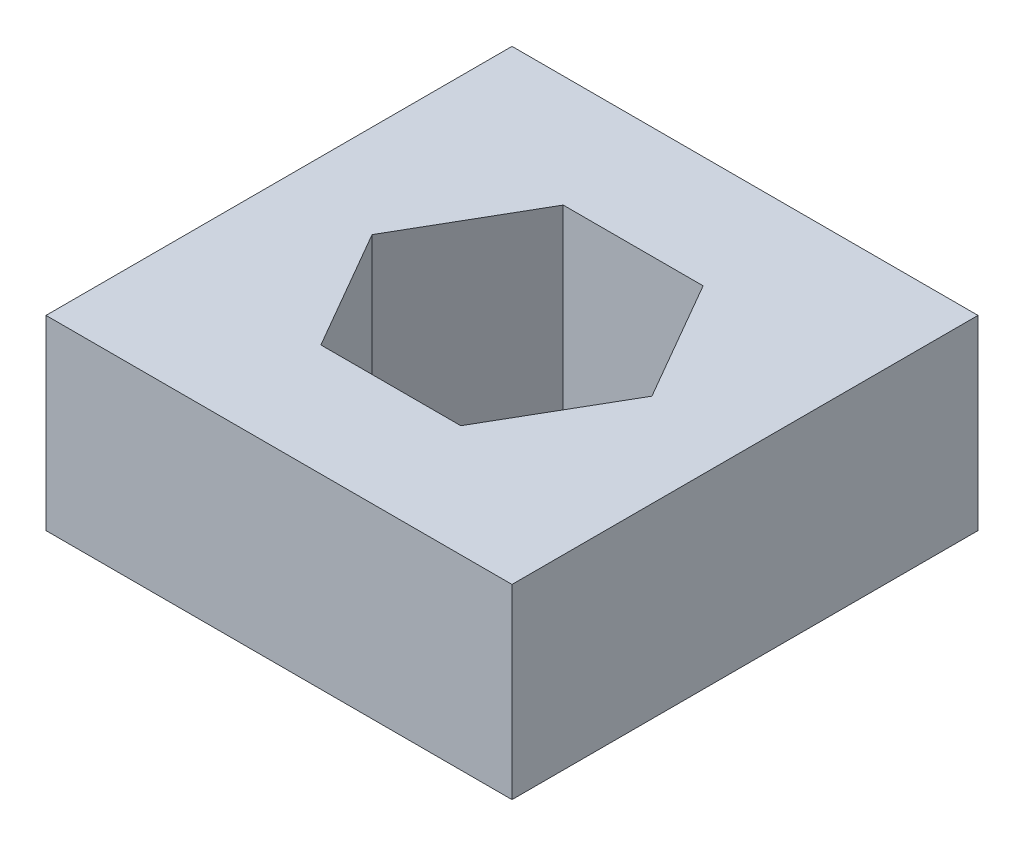
ISO-10303-21;
HEADER;
FILE_DESCRIPTION(('STEP AP214'),'2;1');
FILE_NAME('part.step','',(''),(''),'','','');
FILE_SCHEMA(('AUTOMOTIVE_DESIGN { 1 0 10303 214 1 1 1 1 }'));
ENDSEC;
DATA;
#1=APPLICATION_CONTEXT('core data for automotive mechanical design processes');
#2=APPLICATION_PROTOCOL_DEFINITION('international standard','automotive_design',2000,#1);
#3=PRODUCT_CONTEXT('',#1,'mechanical');
#4=PRODUCT('Part','Part','',(#3));
#5=PRODUCT_RELATED_PRODUCT_CATEGORY('part','',(#4));
#6=PRODUCT_DEFINITION_FORMATION('','',#4);
#7=PRODUCT_DEFINITION_CONTEXT('part definition',#1,'design');
#8=PRODUCT_DEFINITION('design','',#6,#7);
#9=PRODUCT_DEFINITION_SHAPE('','',#8);
#10=(LENGTH_UNIT() NAMED_UNIT(*) SI_UNIT(.MILLI.,.METRE.));
#11=(NAMED_UNIT(*) PLANE_ANGLE_UNIT() SI_UNIT($,.RADIAN.));
#12=(NAMED_UNIT(*) SI_UNIT($,.STERADIAN.) SOLID_ANGLE_UNIT());
#13=UNCERTAINTY_MEASURE_WITH_UNIT(LENGTH_MEASURE(1.E-05),#10,'distance_accuracy_value','');
#14=(GEOMETRIC_REPRESENTATION_CONTEXT(3) GLOBAL_UNCERTAINTY_ASSIGNED_CONTEXT((#13)) GLOBAL_UNIT_ASSIGNED_CONTEXT((#10,
#11,#12)) REPRESENTATION_CONTEXT('',''));
#15=CARTESIAN_POINT('',(0.,0.,0.));
#16=DIRECTION('',(0.,0.,1.));
#17=DIRECTION('',(1.,0.,0.));
#18=AXIS2_PLACEMENT_3D('',#15,#16,#17);
#19=CARTESIAN_POINT('',(0.,2.,0.));
#20=DIRECTION('',(0.,1.,0.));
#21=DIRECTION('',(0.,0.,1.));
#22=AXIS2_PLACEMENT_3D('',#19,#20,#21);
#23=PLANE('',#22);
#24=DIRECTION('',(0.,0.,1.));
#25=VECTOR('',#24,1.);
#26=CARTESIAN_POINT('',(-2.19330855018587,2.,-1.75650557620818));
#27=LINE('',#26,#25);
#28=CARTESIAN_POINT('',(-2.19330855018587,2.,-1.75650557620818));
#29=VERTEX_POINT('',#28);
#30=CARTESIAN_POINT('',(-2.19330855018587,2.,3.24349442379182));
#31=VERTEX_POINT('',#30);
#32=EDGE_CURVE('E165',#29,#31,#27,.T.);
#33=ORIENTED_EDGE('',*,*,#32,.T.);
#34=DIRECTION('',(1.,0.,0.));
#35=VECTOR('',#34,1.);
#36=CARTESIAN_POINT('',(-2.19330855018587,2.,3.24349442379182));
#37=LINE('',#36,#35);
#38=CARTESIAN_POINT('',(2.80669144981413,2.,3.24349442379182));
#39=VERTEX_POINT('',#38);
#40=EDGE_CURVE('E168',#31,#39,#37,.T.);
#41=ORIENTED_EDGE('',*,*,#40,.T.);
#42=DIRECTION('',(0.,0.,-1.));
#43=VECTOR('',#42,1.);
#44=CARTESIAN_POINT('',(2.80669144981413,2.,-1.75650557620818));
#45=LINE('',#44,#43);
#46=CARTESIAN_POINT('',(2.80669144981413,2.,-1.75650557620818));
#47=VERTEX_POINT('',#46);
#48=EDGE_CURVE('E171',#39,#47,#45,.T.);
#49=ORIENTED_EDGE('',*,*,#48,.T.);
#50=DIRECTION('',(-1.,0.,0.));
#51=VECTOR('',#50,1.);
#52=CARTESIAN_POINT('',(-2.19330855018587,2.,-1.75650557620818));
#53=LINE('',#52,#51);
#54=EDGE_CURVE('E173',#47,#29,#53,.T.);
#55=ORIENTED_EDGE('',*,*,#54,.T.);
#56=EDGE_LOOP('',(#33,#41,#49,#55));
#57=FACE_BOUND('',#56,.T.);
#58=DIRECTION('',(-0.5,0.,-0.866025403784438));
#59=VECTOR('',#58,1.);
#60=CARTESIAN_POINT('',(1.80780214970715,2.,0.743494423791823));
#61=LINE('',#60,#59);
#62=CARTESIAN_POINT('',(1.80780214970715,2.,0.743494423791823));
#63=VERTEX_POINT('',#62);
#64=CARTESIAN_POINT('',(1.05724679976064,2.,-0.556505576208176));
#65=VERTEX_POINT('',#64);
#66=EDGE_CURVE('E122',#63,#65,#61,.T.);
#67=ORIENTED_EDGE('',*,*,#66,.F.);
#68=DIRECTION('',(0.5,0.,-0.866025403784439));
#69=VECTOR('',#68,1.);
#70=CARTESIAN_POINT('',(1.05724679976064,2.,2.04349442379182));
#71=LINE('',#70,#69);
#72=CARTESIAN_POINT('',(1.05724679976064,2.,2.04349442379182));
#73=VERTEX_POINT('',#72);
#74=EDGE_CURVE('E114',#73,#63,#71,.T.);
#75=ORIENTED_EDGE('',*,*,#74,.F.);
#76=DIRECTION('',(1.,0.,0.));
#77=VECTOR('',#76,1.);
#78=CARTESIAN_POINT('',(-0.443863900132386,2.,2.04349442379182));
#79=LINE('',#78,#77);
#80=CARTESIAN_POINT('',(-0.443863900132386,2.,2.04349442379182));
#81=VERTEX_POINT('',#80);
#82=EDGE_CURVE('E143',#81,#73,#79,.T.);
#83=ORIENTED_EDGE('',*,*,#82,.F.);
#84=DIRECTION('',(0.5,0.,0.866025403784439));
#85=VECTOR('',#84,1.);
#86=CARTESIAN_POINT('',(-1.1944192500789,2.,0.743494423791824));
#87=LINE('',#86,#85);
#88=CARTESIAN_POINT('',(-1.1944192500789,2.,0.743494423791824));
#89=VERTEX_POINT('',#88);
#90=EDGE_CURVE('E141',#89,#81,#87,.T.);
#91=ORIENTED_EDGE('',*,*,#90,.F.);
#92=DIRECTION('',(-0.5,0.,0.866025403784439));
#93=VECTOR('',#92,1.);
#94=CARTESIAN_POINT('',(-0.443863900132386,2.,-0.556505576208177));
#95=LINE('',#94,#93);
#96=CARTESIAN_POINT('',(-0.443863900132386,2.,-0.556505576208177));
#97=VERTEX_POINT('',#96);
#98=EDGE_CURVE('E137',#97,#89,#95,.T.);
#99=ORIENTED_EDGE('',*,*,#98,.F.);
#100=DIRECTION('',(-1.,0.,0.));
#101=VECTOR('',#100,1.);
#102=CARTESIAN_POINT('',(1.05724679976064,2.,-0.556505576208176));
#103=LINE('',#102,#101);
#104=EDGE_CURVE('E135',#65,#97,#103,.T.);
#105=ORIENTED_EDGE('',*,*,#104,.F.);
#106=EDGE_LOOP('',(#67,#75,#83,#91,#99,#105));
#107=FACE_BOUND('',#106,.T.);
#108=ADVANCED_FACE('F37',(#57,#107),#23,.T.);
#109=CARTESIAN_POINT('',(0.,0.,0.));
#110=DIRECTION('',(0.,1.,0.));
#111=DIRECTION('',(0.,0.,1.));
#112=AXIS2_PLACEMENT_3D('',#109,#110,#111);
#113=PLANE('',#112);
#114=DIRECTION('',(0.,0.,1.));
#115=VECTOR('',#114,1.);
#116=CARTESIAN_POINT('',(-2.19330855018587,0.,-1.75650557620818));
#117=LINE('',#116,#115);
#118=CARTESIAN_POINT('',(-2.19330855018587,0.,-1.75650557620818));
#119=VERTEX_POINT('',#118);
#120=CARTESIAN_POINT('',(-2.19330855018587,0.,3.24349442379182));
#121=VERTEX_POINT('',#120);
#122=EDGE_CURVE('E130',#119,#121,#117,.T.);
#123=ORIENTED_EDGE('',*,*,#122,.F.);
#124=DIRECTION('',(-1.,0.,0.));
#125=VECTOR('',#124,1.);
#126=CARTESIAN_POINT('',(-2.19330855018587,0.,-1.75650557620818));
#127=LINE('',#126,#125);
#128=CARTESIAN_POINT('',(2.80669144981413,0.,-1.75650557620818));
#129=VERTEX_POINT('',#128);
#130=EDGE_CURVE('E169',#129,#119,#127,.T.);
#131=ORIENTED_EDGE('',*,*,#130,.F.);
#132=DIRECTION('',(0.,0.,-1.));
#133=VECTOR('',#132,1.);
#134=CARTESIAN_POINT('',(2.80669144981413,0.,-1.75650557620818));
#135=LINE('',#134,#133);
#136=CARTESIAN_POINT('',(2.80669144981413,0.,3.24349442379182));
#137=VERTEX_POINT('',#136);
#138=EDGE_CURVE('E180',#137,#129,#135,.T.);
#139=ORIENTED_EDGE('',*,*,#138,.F.);
#140=DIRECTION('',(1.,0.,0.));
#141=VECTOR('',#140,1.);
#142=CARTESIAN_POINT('',(-2.19330855018587,0.,3.24349442379182));
#143=LINE('',#142,#141);
#144=EDGE_CURVE('E178',#121,#137,#143,.T.);
#145=ORIENTED_EDGE('',*,*,#144,.F.);
#146=EDGE_LOOP('',(#123,#131,#139,#145));
#147=FACE_BOUND('',#146,.T.);
#148=DIRECTION('',(0.5,0.,-0.866025403784439));
#149=VECTOR('',#148,1.);
#150=CARTESIAN_POINT('',(1.05724679976064,0.,2.04349442379182));
#151=LINE('',#150,#149);
#152=CARTESIAN_POINT('',(1.05724679976064,0.,2.04349442379182));
#153=VERTEX_POINT('',#152);
#154=CARTESIAN_POINT('',(1.80780214970715,0.,0.743494423791823));
#155=VERTEX_POINT('',#154);
#156=EDGE_CURVE('E60',#153,#155,#151,.T.);
#157=ORIENTED_EDGE('',*,*,#156,.T.);
#158=DIRECTION('',(-0.5,0.,-0.866025403784438));
#159=VECTOR('',#158,1.);
#160=CARTESIAN_POINT('',(1.80780214970715,0.,0.743494423791823));
#161=LINE('',#160,#159);
#162=CARTESIAN_POINT('',(1.05724679976064,0.,-0.556505576208176));
#163=VERTEX_POINT('',#162);
#164=EDGE_CURVE('E129',#155,#163,#161,.T.);
#165=ORIENTED_EDGE('',*,*,#164,.T.);
#166=DIRECTION('',(-1.,0.,0.));
#167=VECTOR('',#166,1.);
#168=CARTESIAN_POINT('',(1.05724679976064,0.,-0.556505576208176));
#169=LINE('',#168,#167);
#170=CARTESIAN_POINT('',(-0.443863900132386,0.,-0.556505576208177));
#171=VERTEX_POINT('',#170);
#172=EDGE_CURVE('E147',#163,#171,#169,.T.);
#173=ORIENTED_EDGE('',*,*,#172,.T.);
#174=DIRECTION('',(-0.5,0.,0.866025403784439));
#175=VECTOR('',#174,1.);
#176=CARTESIAN_POINT('',(-0.443863900132386,0.,-0.556505576208177));
#177=LINE('',#176,#175);
#178=CARTESIAN_POINT('',(-1.1944192500789,0.,0.743494423791824));
#179=VERTEX_POINT('',#178);
#180=EDGE_CURVE('E150',#171,#179,#177,.T.);
#181=ORIENTED_EDGE('',*,*,#180,.T.);
#182=DIRECTION('',(0.5,0.,0.866025403784439));
#183=VECTOR('',#182,1.);
#184=CARTESIAN_POINT('',(-1.1944192500789,0.,0.743494423791824));
#185=LINE('',#184,#183);
#186=CARTESIAN_POINT('',(-0.443863900132386,0.,2.04349442379182));
#187=VERTEX_POINT('',#186);
#188=EDGE_CURVE('E153',#179,#187,#185,.T.);
#189=ORIENTED_EDGE('',*,*,#188,.T.);
#190=DIRECTION('',(1.,0.,0.));
#191=VECTOR('',#190,1.);
#192=CARTESIAN_POINT('',(-0.443863900132386,0.,2.04349442379182));
#193=LINE('',#192,#191);
#194=EDGE_CURVE('E123',#187,#153,#193,.T.);
#195=ORIENTED_EDGE('',*,*,#194,.T.);
#196=EDGE_LOOP('',(#157,#165,#173,#181,#189,#195));
#197=FACE_BOUND('',#196,.T.);
#198=ADVANCED_FACE('F198',(#147,#197),#113,.F.);
#199=CARTESIAN_POINT('',(-2.19330855018587,2.,-1.75650557620818));
#200=DIRECTION('',(1.,0.,0.));
#201=DIRECTION('',(0.,0.,-1.));
#202=AXIS2_PLACEMENT_3D('',#199,#200,#201);
#203=PLANE('',#202);
#204=ORIENTED_EDGE('',*,*,#122,.T.);
#205=DIRECTION('',(0.,-1.,0.));
#206=VECTOR('',#205,1.);
#207=CARTESIAN_POINT('',(-2.19330855018587,2.,3.24349442379182));
#208=LINE('',#207,#206);
#209=EDGE_CURVE('E11',#31,#121,#208,.T.);
#210=ORIENTED_EDGE('',*,*,#209,.F.);
#211=ORIENTED_EDGE('',*,*,#32,.F.);
#212=DIRECTION('',(0.,-1.,0.));
#213=VECTOR('',#212,1.);
#214=CARTESIAN_POINT('',(-2.19330855018587,2.,-1.75650557620818));
#215=LINE('',#214,#213);
#216=EDGE_CURVE('E175',#29,#119,#215,.T.);
#217=ORIENTED_EDGE('',*,*,#216,.T.);
#218=EDGE_LOOP('',(#204,#210,#211,#217));
#219=FACE_BOUND('',#218,.T.);
#220=ADVANCED_FACE('F39',(#219),#203,.F.);
#221=CARTESIAN_POINT('',(-2.19330855018587,2.,3.24349442379182));
#222=DIRECTION('',(0.,0.,-1.));
#223=DIRECTION('',(-1.,0.,0.));
#224=AXIS2_PLACEMENT_3D('',#221,#222,#223);
#225=PLANE('',#224);
#226=ORIENTED_EDGE('',*,*,#144,.T.);
#227=DIRECTION('',(0.,-1.,0.));
#228=VECTOR('',#227,1.);
#229=CARTESIAN_POINT('',(2.80669144981413,2.,3.24349442379182));
#230=LINE('',#229,#228);
#231=EDGE_CURVE('E45',#39,#137,#230,.T.);
#232=ORIENTED_EDGE('',*,*,#231,.F.);
#233=ORIENTED_EDGE('',*,*,#40,.F.);
#234=ORIENTED_EDGE('',*,*,#209,.T.);
#235=EDGE_LOOP('',(#226,#232,#233,#234));
#236=FACE_BOUND('',#235,.T.);
#237=ADVANCED_FACE('F208',(#236),#225,.F.);
#238=CARTESIAN_POINT('',(2.80669144981413,2.,-1.75650557620818));
#239=DIRECTION('',(-1.,0.,0.));
#240=DIRECTION('',(0.,0.,1.));
#241=AXIS2_PLACEMENT_3D('',#238,#239,#240);
#242=PLANE('',#241);
#243=ORIENTED_EDGE('',*,*,#138,.T.);
#244=DIRECTION('',(0.,-1.,0.));
#245=VECTOR('',#244,1.);
#246=CARTESIAN_POINT('',(2.80669144981413,2.,-1.75650557620818));
#247=LINE('',#246,#245);
#248=EDGE_CURVE('E185',#47,#129,#247,.T.);
#249=ORIENTED_EDGE('',*,*,#248,.F.);
#250=ORIENTED_EDGE('',*,*,#48,.F.);
#251=ORIENTED_EDGE('',*,*,#231,.T.);
#252=EDGE_LOOP('',(#243,#249,#250,#251));
#253=FACE_BOUND('',#252,.T.);
#254=ADVANCED_FACE('F192',(#253),#242,.F.);
#255=CARTESIAN_POINT('',(-2.19330855018587,2.,-1.75650557620818));
#256=DIRECTION('',(0.,0.,1.));
#257=DIRECTION('',(1.,0.,0.));
#258=AXIS2_PLACEMENT_3D('',#255,#256,#257);
#259=PLANE('',#258);
#260=ORIENTED_EDGE('',*,*,#130,.T.);
#261=ORIENTED_EDGE('',*,*,#216,.F.);
#262=ORIENTED_EDGE('',*,*,#54,.F.);
#263=ORIENTED_EDGE('',*,*,#248,.T.);
#264=EDGE_LOOP('',(#260,#261,#262,#263));
#265=FACE_BOUND('',#264,.T.);
#266=ADVANCED_FACE('F202',(#265),#259,.F.);
#267=CARTESIAN_POINT('',(1.05724679976064,2.,2.04349442379182));
#268=DIRECTION('',(-0.866025403784439,0.,-0.5));
#269=DIRECTION('',(-0.5,0.,0.866025403784439));
#270=AXIS2_PLACEMENT_3D('',#267,#268,#269);
#271=PLANE('',#270);
#272=ORIENTED_EDGE('',*,*,#156,.F.);
#273=DIRECTION('',(0.,-1.,0.));
#274=VECTOR('',#273,1.);
#275=CARTESIAN_POINT('',(1.05724679976064,2.,2.04349442379182));
#276=LINE('',#275,#274);
#277=EDGE_CURVE('E118',#73,#153,#276,.T.);
#278=ORIENTED_EDGE('',*,*,#277,.F.);
#279=ORIENTED_EDGE('',*,*,#74,.T.);
#280=DIRECTION('',(0.,-1.,0.));
#281=VECTOR('',#280,1.);
#282=CARTESIAN_POINT('',(1.80780214970715,2.,0.743494423791823));
#283=LINE('',#282,#281);
#284=EDGE_CURVE('E117',#63,#155,#283,.T.);
#285=ORIENTED_EDGE('',*,*,#284,.T.);
#286=EDGE_LOOP('',(#272,#278,#279,#285));
#287=FACE_BOUND('',#286,.T.);
#288=ADVANCED_FACE('F116',(#287),#271,.T.);
#289=CARTESIAN_POINT('',(1.80780214970715,2.,0.743494423791823));
#290=DIRECTION('',(-0.866025403784439,0.,0.5));
#291=DIRECTION('',(0.5,0.,0.866025403784439));
#292=AXIS2_PLACEMENT_3D('',#289,#290,#291);
#293=PLANE('',#292);
#294=ORIENTED_EDGE('',*,*,#164,.F.);
#295=ORIENTED_EDGE('',*,*,#284,.F.);
#296=ORIENTED_EDGE('',*,*,#66,.T.);
#297=DIRECTION('',(0.,-1.,0.));
#298=VECTOR('',#297,1.);
#299=CARTESIAN_POINT('',(1.05724679976064,2.,-0.556505576208176));
#300=LINE('',#299,#298);
#301=EDGE_CURVE('E131',#65,#163,#300,.T.);
#302=ORIENTED_EDGE('',*,*,#301,.T.);
#303=EDGE_LOOP('',(#294,#295,#296,#302));
#304=FACE_BOUND('',#303,.T.);
#305=ADVANCED_FACE('F126',(#304),#293,.T.);
#306=CARTESIAN_POINT('',(1.05724679976064,2.,-0.556505576208176));
#307=DIRECTION('',(0.,0.,1.));
#308=DIRECTION('',(1.,0.,0.));
#309=AXIS2_PLACEMENT_3D('',#306,#307,#308);
#310=PLANE('',#309);
#311=ORIENTED_EDGE('',*,*,#172,.F.);
#312=ORIENTED_EDGE('',*,*,#301,.F.);
#313=ORIENTED_EDGE('',*,*,#104,.T.);
#314=DIRECTION('',(0.,-1.,0.));
#315=VECTOR('',#314,1.);
#316=CARTESIAN_POINT('',(-0.443863900132386,2.,-0.556505576208177));
#317=LINE('',#316,#315);
#318=EDGE_CURVE('E162',#97,#171,#317,.T.);
#319=ORIENTED_EDGE('',*,*,#318,.T.);
#320=EDGE_LOOP('',(#311,#312,#313,#319));
#321=FACE_BOUND('',#320,.T.);
#322=ADVANCED_FACE('F231',(#321),#310,.T.);
#323=CARTESIAN_POINT('',(-0.443863900132386,2.,-0.556505576208177));
#324=DIRECTION('',(0.866025403784439,0.,0.5));
#325=DIRECTION('',(0.5,0.,-0.866025403784439));
#326=AXIS2_PLACEMENT_3D('',#323,#324,#325);
#327=PLANE('',#326);
#328=ORIENTED_EDGE('',*,*,#180,.F.);
#329=ORIENTED_EDGE('',*,*,#318,.F.);
#330=ORIENTED_EDGE('',*,*,#98,.T.);
#331=DIRECTION('',(0.,-1.,0.));
#332=VECTOR('',#331,1.);
#333=CARTESIAN_POINT('',(-1.1944192500789,2.,0.743494423791824));
#334=LINE('',#333,#332);
#335=EDGE_CURVE('E160',#89,#179,#334,.T.);
#336=ORIENTED_EDGE('',*,*,#335,.T.);
#337=EDGE_LOOP('',(#328,#329,#330,#336));
#338=FACE_BOUND('',#337,.T.);
#339=ADVANCED_FACE('F235',(#338),#327,.T.);
#340=CARTESIAN_POINT('',(-1.1944192500789,2.,0.743494423791824));
#341=DIRECTION('',(0.866025403784439,0.,-0.5));
#342=DIRECTION('',(-0.5,0.,-0.866025403784439));
#343=AXIS2_PLACEMENT_3D('',#340,#341,#342);
#344=PLANE('',#343);
#345=ORIENTED_EDGE('',*,*,#188,.F.);
#346=ORIENTED_EDGE('',*,*,#335,.F.);
#347=ORIENTED_EDGE('',*,*,#90,.T.);
#348=DIRECTION('',(0.,-1.,0.));
#349=VECTOR('',#348,1.);
#350=CARTESIAN_POINT('',(-0.443863900132386,2.,2.04349442379182));
#351=LINE('',#350,#349);
#352=EDGE_CURVE('E52',#81,#187,#351,.T.);
#353=ORIENTED_EDGE('',*,*,#352,.T.);
#354=EDGE_LOOP('',(#345,#346,#347,#353));
#355=FACE_BOUND('',#354,.T.);
#356=ADVANCED_FACE('F241',(#355),#344,.T.);
#357=CARTESIAN_POINT('',(-0.443863900132386,2.,2.04349442379182));
#358=DIRECTION('',(0.,0.,-1.));
#359=DIRECTION('',(-1.,0.,0.));
#360=AXIS2_PLACEMENT_3D('',#357,#358,#359);
#361=PLANE('',#360);
#362=ORIENTED_EDGE('',*,*,#194,.F.);
#363=ORIENTED_EDGE('',*,*,#352,.F.);
#364=ORIENTED_EDGE('',*,*,#82,.T.);
#365=ORIENTED_EDGE('',*,*,#277,.T.);
#366=EDGE_LOOP('',(#362,#363,#364,#365));
#367=FACE_BOUND('',#366,.T.);
#368=ADVANCED_FACE('F245',(#367),#361,.T.);
#369=CLOSED_SHELL('',(#108,#198,#220,#237,#254,#266,#288,#305,#322,#339,#356,#368));
#370=MANIFOLD_SOLID_BREP('B2',#369);
#371=ADVANCED_BREP_SHAPE_REPRESENTATION('',(#18,#370),#14);
#372=SHAPE_DEFINITION_REPRESENTATION(#9,#371);
ENDSEC;
END-ISO-10303-21;
